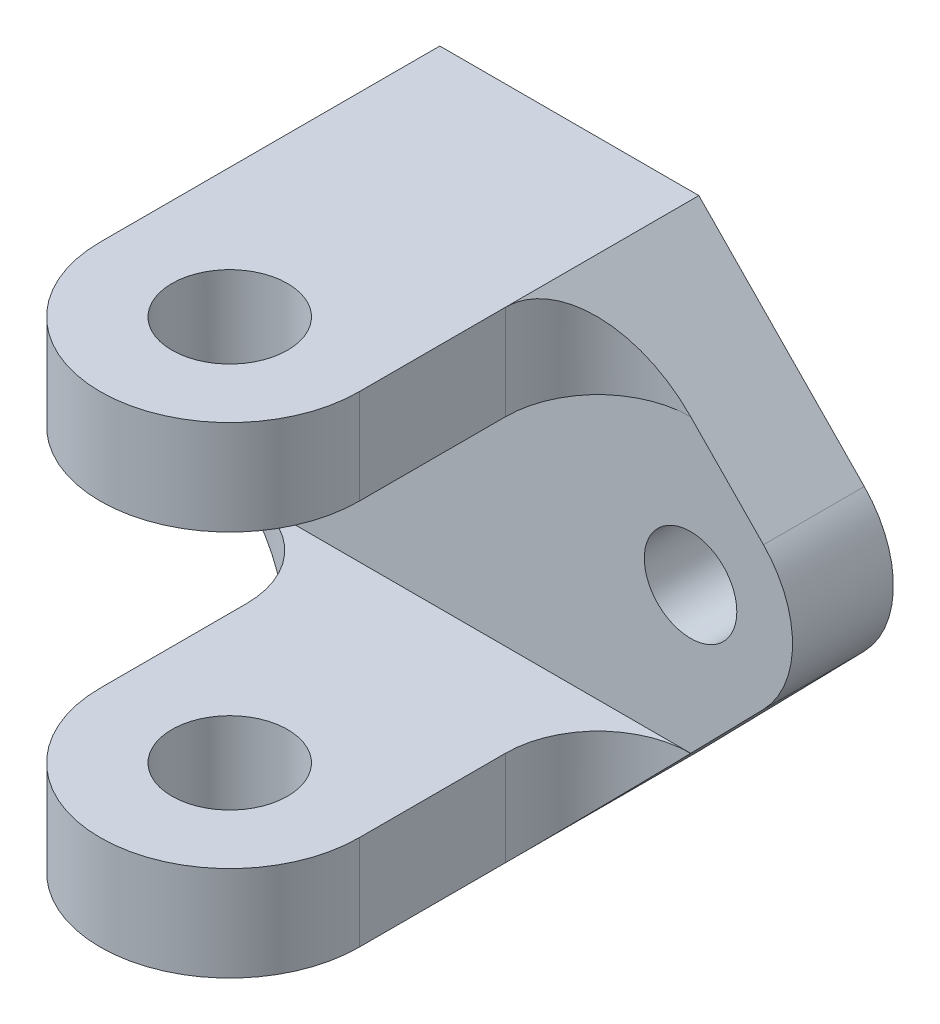
ISO-10303-21;
HEADER;
FILE_DESCRIPTION(('STEP AP214'),'2;1');
FILE_NAME('part.step','',(''),(''),'','','');
FILE_SCHEMA(('AUTOMOTIVE_DESIGN { 1 0 10303 214 1 1 1 1 }'));
ENDSEC;
DATA;
#1=APPLICATION_CONTEXT('core data for automotive mechanical design processes');
#2=APPLICATION_PROTOCOL_DEFINITION('international standard','automotive_design',2000,#1);
#3=PRODUCT_CONTEXT('',#1,'mechanical');
#4=PRODUCT('Part','Part','',(#3));
#5=PRODUCT_RELATED_PRODUCT_CATEGORY('part','',(#4));
#6=PRODUCT_DEFINITION_FORMATION('','',#4);
#7=PRODUCT_DEFINITION_CONTEXT('part definition',#1,'design');
#8=PRODUCT_DEFINITION('design','',#6,#7);
#9=PRODUCT_DEFINITION_SHAPE('','',#8);
#10=(LENGTH_UNIT() NAMED_UNIT(*) SI_UNIT(.MILLI.,.METRE.));
#11=(NAMED_UNIT(*) PLANE_ANGLE_UNIT() SI_UNIT($,.RADIAN.));
#12=(NAMED_UNIT(*) SI_UNIT($,.STERADIAN.) SOLID_ANGLE_UNIT());
#13=UNCERTAINTY_MEASURE_WITH_UNIT(LENGTH_MEASURE(1.E-05),#10,'distance_accuracy_value','');
#14=(GEOMETRIC_REPRESENTATION_CONTEXT(3) GLOBAL_UNCERTAINTY_ASSIGNED_CONTEXT((#13)) GLOBAL_UNIT_ASSIGNED_CONTEXT((#10,
#11,#12)) REPRESENTATION_CONTEXT('',''));
#15=CARTESIAN_POINT('',(0.,0.,0.));
#16=DIRECTION('',(0.,0.,1.));
#17=DIRECTION('',(1.,0.,0.));
#18=AXIS2_PLACEMENT_3D('',#15,#16,#17);
#19=CARTESIAN_POINT('',(-8.89,-87.0039032824825,0.));
#20=DIRECTION('',(1.,0.,0.));
#21=DIRECTION('',(0.,0.,-1.));
#22=AXIS2_PLACEMENT_3D('',#19,#20,#21);
#23=PLANE('',#22);
#24=DIRECTION('',(0.,0.,1.));
#25=VECTOR('',#24,1.);
#26=CARTESIAN_POINT('',(-8.89,16.51,0.));
#27=LINE('',#26,#25);
#28=CARTESIAN_POINT('',(-8.89,16.51,15.81));
#29=VERTEX_POINT('',#28);
#30=CARTESIAN_POINT('',(-8.89,16.51,25.8481308));
#31=VERTEX_POINT('',#30);
#32=EDGE_CURVE('E150',#29,#31,#27,.T.);
#33=ORIENTED_EDGE('',*,*,#32,.F.);
#34=DIRECTION('',(0.,1.,0.));
#35=VECTOR('',#34,1.);
#36=CARTESIAN_POINT('',(-8.89,9.99999999999999,15.81));
#37=LINE('',#36,#35);
#38=CARTESIAN_POINT('',(-8.89,10.,15.81));
#39=VERTEX_POINT('',#38);
#40=EDGE_CURVE('E143',#29,#39,#37,.F.);
#41=ORIENTED_EDGE('',*,*,#40,.T.);
#42=DIRECTION('',(0.,0.,-1.));
#43=VECTOR('',#42,1.);
#44=CARTESIAN_POINT('',(-8.88999999999999,10.,62.46));
#45=LINE('',#44,#43);
#46=CARTESIAN_POINT('',(-8.89,9.99999999999999,25.8481308));
#47=VERTEX_POINT('',#46);
#48=EDGE_CURVE('E147',#47,#39,#45,.T.);
#49=ORIENTED_EDGE('',*,*,#48,.F.);
#50=DIRECTION('',(0.,1.,0.));
#51=VECTOR('',#50,1.);
#52=CARTESIAN_POINT('',(-8.89,-87.0039032824825,25.8481308));
#53=LINE('',#52,#51);
#54=EDGE_CURVE('E296',#47,#31,#53,.T.);
#55=ORIENTED_EDGE('',*,*,#54,.T.);
#56=EDGE_LOOP('',(#33,#41,#49,#55));
#57=FACE_BOUND('',#56,.T.);
#58=ADVANCED_FACE('F43',(#57),#23,.F.);
#59=CARTESIAN_POINT('',(8.89,-87.0039032824825,0.));
#60=DIRECTION('',(1.,0.,0.));
#61=DIRECTION('',(0.,0.,-1.));
#62=AXIS2_PLACEMENT_3D('',#59,#60,#61);
#63=PLANE('',#62);
#64=DIRECTION('',(0.,0.,-1.));
#65=VECTOR('',#64,1.);
#66=CARTESIAN_POINT('',(8.89,10.,62.46));
#67=LINE('',#66,#65);
#68=CARTESIAN_POINT('',(8.89,9.99999999999999,25.8481308));
#69=VERTEX_POINT('',#68);
#70=CARTESIAN_POINT('',(8.89,10.,15.81));
#71=VERTEX_POINT('',#70);
#72=EDGE_CURVE('E166',#69,#71,#67,.T.);
#73=ORIENTED_EDGE('',*,*,#72,.T.);
#74=DIRECTION('',(0.,1.,0.));
#75=VECTOR('',#74,1.);
#76=CARTESIAN_POINT('',(8.89,-87.0039032824825,15.81));
#77=LINE('',#76,#75);
#78=CARTESIAN_POINT('',(8.89,16.51,15.81));
#79=VERTEX_POINT('',#78);
#80=EDGE_CURVE('E232',#71,#79,#77,.T.);
#81=ORIENTED_EDGE('',*,*,#80,.T.);
#82=DIRECTION('',(0.,0.,1.));
#83=VECTOR('',#82,1.);
#84=CARTESIAN_POINT('',(8.89,16.51,0.));
#85=LINE('',#84,#83);
#86=CARTESIAN_POINT('',(8.89,16.51,25.8481308));
#87=VERTEX_POINT('',#86);
#88=EDGE_CURVE('E293',#79,#87,#85,.T.);
#89=ORIENTED_EDGE('',*,*,#88,.T.);
#90=DIRECTION('',(0.,1.,0.));
#91=VECTOR('',#90,1.);
#92=CARTESIAN_POINT('',(8.89,-87.0039032824825,25.8481308));
#93=LINE('',#92,#91);
#94=EDGE_CURVE('E309',#69,#87,#93,.T.);
#95=ORIENTED_EDGE('',*,*,#94,.F.);
#96=EDGE_LOOP('',(#73,#81,#89,#95));
#97=FACE_BOUND('',#96,.T.);
#98=ADVANCED_FACE('F376',(#97),#63,.T.);
#99=CARTESIAN_POINT('',(15.24,0.,45.463373453053));
#100=DIRECTION('',(0.,0.,-1.));
#101=DIRECTION('',(-1.,0.,0.));
#102=AXIS2_PLACEMENT_3D('',#99,#100,#101);
#103=CYLINDRICAL_SURFACE('',#102,7.);
#104=CARTESIAN_POINT('',(15.24,0.,2.54));
#105=DIRECTION('',(0.,0.,1.));
#106=DIRECTION('',(1.,0.,0.));
#107=AXIS2_PLACEMENT_3D('',#104,#105,#106);
#108=CIRCLE('',#107,6.99999999999999);
#109=CARTESIAN_POINT('',(20.2456912582253,-4.89316411203698,2.54));
#110=VERTEX_POINT('',#109);
#111=CARTESIAN_POINT('',(20.2456912582253,4.89316411203699,2.54));
#112=VERTEX_POINT('',#111);
#113=EDGE_CURVE('E492',#110,#112,#108,.T.);
#114=ORIENTED_EDGE('',*,*,#113,.T.);
#115=DIRECTION('',(0.,0.,-1.));
#116=VECTOR('',#115,1.);
#117=CARTESIAN_POINT('',(20.2456912582253,4.89316411203699,25.7050792549621));
#118=LINE('',#117,#116);
#119=CARTESIAN_POINT('',(20.2456912582253,4.89316411203699,9.46));
#120=VERTEX_POINT('',#119);
#121=EDGE_CURVE('E209',#120,#112,#118,.T.);
#122=ORIENTED_EDGE('',*,*,#121,.F.);
#123=CARTESIAN_POINT('',(15.24,0.,9.46));
#124=DIRECTION('',(0.,0.,-1.));
#125=DIRECTION('',(-1.,0.,0.));
#126=AXIS2_PLACEMENT_3D('',#123,#124,#125);
#127=CIRCLE('',#126,7.);
#128=CARTESIAN_POINT('',(20.2456912582253,-4.89316411203699,9.46));
#129=VERTEX_POINT('',#128);
#130=EDGE_CURVE('E207',#129,#120,#127,.F.);
#131=ORIENTED_EDGE('',*,*,#130,.F.);
#132=DIRECTION('',(0.,0.,-1.));
#133=VECTOR('',#132,1.);
#134=CARTESIAN_POINT('',(20.2456912582253,-4.89316411203698,25.7050792549621));
#135=LINE('',#134,#133);
#136=EDGE_CURVE('E271',#129,#110,#135,.T.);
#137=ORIENTED_EDGE('',*,*,#136,.T.);
#138=EDGE_LOOP('',(#114,#122,#131,#137));
#139=FACE_BOUND('',#138,.T.);
#140=ADVANCED_FACE('F438',(#139),#103,.T.);
#141=DIRECTION('',(0.,0.,1.));
#142=VECTOR('',#141,1.);
#143=CARTESIAN_POINT('',(-8.88999999999999,-10.,62.46));
#144=LINE('',#143,#142);
#145=CARTESIAN_POINT('',(-8.89,-10.,15.81));
#146=VERTEX_POINT('',#145);
#147=CARTESIAN_POINT('',(-8.89,-10.,25.8481308));
#148=VERTEX_POINT('',#147);
#149=EDGE_CURVE('E244',#146,#148,#144,.T.);
#150=ORIENTED_EDGE('',*,*,#149,.F.);
#151=DIRECTION('',(0.,-1.,0.));
#152=VECTOR('',#151,1.);
#153=CARTESIAN_POINT('',(-8.89,-16.51,15.81));
#154=LINE('',#153,#152);
#155=CARTESIAN_POINT('',(-8.89,-16.51,15.81));
#156=VERTEX_POINT('',#155);
#157=EDGE_CURVE('E214',#146,#156,#154,.T.);
#158=ORIENTED_EDGE('',*,*,#157,.T.);
#159=DIRECTION('',(0.,0.,1.));
#160=VECTOR('',#159,1.);
#161=CARTESIAN_POINT('',(-8.89,-16.51,0.));
#162=LINE('',#161,#160);
#163=CARTESIAN_POINT('',(-8.89,-16.51,25.8481308));
#164=VERTEX_POINT('',#163);
#165=EDGE_CURVE('E304',#156,#164,#162,.T.);
#166=ORIENTED_EDGE('',*,*,#165,.T.);
#167=EDGE_CURVE('E255',#164,#148,#53,.T.);
#168=ORIENTED_EDGE('',*,*,#167,.T.);
#169=EDGE_LOOP('',(#150,#158,#166,#168));
#170=FACE_BOUND('',#169,.T.);
#171=ADVANCED_FACE('F251',(#170),#23,.F.);
#172=CARTESIAN_POINT('',(-15.24,0.,45.463373453053));
#173=DIRECTION('',(0.,0.,-1.));
#174=DIRECTION('',(-1.,0.,0.));
#175=AXIS2_PLACEMENT_3D('',#172,#173,#174);
#176=CYLINDRICAL_SURFACE('',#175,7.);
#177=DIRECTION('',(0.,0.,-1.));
#178=VECTOR('',#177,1.);
#179=CARTESIAN_POINT('',(-20.2456912582253,4.89316411203698,25.7050792549621));
#180=LINE('',#179,#178);
#181=CARTESIAN_POINT('',(-20.2456912582253,4.89316411203698,9.46));
#182=VERTEX_POINT('',#181);
#183=CARTESIAN_POINT('',(-20.2456912582253,4.89316411203698,2.54));
#184=VERTEX_POINT('',#183);
#185=EDGE_CURVE('E210',#182,#184,#180,.T.);
#186=ORIENTED_EDGE('',*,*,#185,.T.);
#187=CARTESIAN_POINT('',(-15.24,0.,2.54));
#188=DIRECTION('',(0.,0.,1.));
#189=DIRECTION('',(1.,0.,0.));
#190=AXIS2_PLACEMENT_3D('',#187,#188,#189);
#191=CIRCLE('',#190,7.);
#192=CARTESIAN_POINT('',(-20.2456912582253,-4.89316411203699,2.54));
#193=VERTEX_POINT('',#192);
#194=EDGE_CURVE('E59',#184,#193,#191,.T.);
#195=ORIENTED_EDGE('',*,*,#194,.T.);
#196=DIRECTION('',(0.,0.,-1.));
#197=VECTOR('',#196,1.);
#198=CARTESIAN_POINT('',(-20.2456912582253,-4.89316411203699,25.7050792549621));
#199=LINE('',#198,#197);
#200=CARTESIAN_POINT('',(-20.2456912582253,-4.89316411203699,9.46));
#201=VERTEX_POINT('',#200);
#202=EDGE_CURVE('E112',#201,#193,#199,.T.);
#203=ORIENTED_EDGE('',*,*,#202,.F.);
#204=CARTESIAN_POINT('',(-15.24,0.,9.46));
#205=DIRECTION('',(0.,0.,-1.));
#206=DIRECTION('',(-1.,0.,0.));
#207=AXIS2_PLACEMENT_3D('',#204,#205,#206);
#208=CIRCLE('',#207,7.);
#209=EDGE_CURVE('E266',#201,#182,#208,.T.);
#210=ORIENTED_EDGE('',*,*,#209,.T.);
#211=EDGE_LOOP('',(#186,#195,#203,#210));
#212=FACE_BOUND('',#211,.T.);
#213=ADVANCED_FACE('F430',(#212),#176,.T.);
#214=DIRECTION('',(0.,0.,1.));
#215=VECTOR('',#214,1.);
#216=CARTESIAN_POINT('',(8.89,-16.51,0.));
#217=LINE('',#216,#215);
#218=CARTESIAN_POINT('',(8.89,-16.51,15.81));
#219=VERTEX_POINT('',#218);
#220=CARTESIAN_POINT('',(8.89,-16.51,25.8481308));
#221=VERTEX_POINT('',#220);
#222=EDGE_CURVE('E300',#219,#221,#217,.T.);
#223=ORIENTED_EDGE('',*,*,#222,.F.);
#224=DIRECTION('',(0.,-1.,0.));
#225=VECTOR('',#224,1.);
#226=CARTESIAN_POINT('',(8.89,-87.0039032824825,15.81));
#227=LINE('',#226,#225);
#228=CARTESIAN_POINT('',(8.89,-9.99999999999999,15.81));
#229=VERTEX_POINT('',#228);
#230=EDGE_CURVE('E155',#219,#229,#227,.F.);
#231=ORIENTED_EDGE('',*,*,#230,.T.);
#232=DIRECTION('',(0.,0.,1.));
#233=VECTOR('',#232,1.);
#234=CARTESIAN_POINT('',(8.89,-9.99999999999999,62.46));
#235=LINE('',#234,#233);
#236=CARTESIAN_POINT('',(8.89,-9.99999999999999,25.8481308));
#237=VERTEX_POINT('',#236);
#238=EDGE_CURVE('E221',#229,#237,#235,.T.);
#239=ORIENTED_EDGE('',*,*,#238,.T.);
#240=EDGE_CURVE('E305',#221,#237,#93,.T.);
#241=ORIENTED_EDGE('',*,*,#240,.F.);
#242=EDGE_LOOP('',(#223,#231,#239,#241));
#243=FACE_BOUND('',#242,.T.);
#244=ADVANCED_FACE('F352',(#243),#63,.T.);
#245=CARTESIAN_POINT('',(-23.24,10.,62.46));
#246=DIRECTION('',(0.,1.,0.));
#247=DIRECTION('',(0.,0.,1.));
#248=AXIS2_PLACEMENT_3D('',#245,#246,#247);
#249=PLANE('',#248);
#250=CARTESIAN_POINT('',(0.,10.,25.8481308));
#251=DIRECTION('',(0.,1.,0.));
#252=DIRECTION('',(0.,0.,1.));
#253=AXIS2_PLACEMENT_3D('',#250,#251,#252);
#254=CIRCLE('',#253,3.96875);
#255=CARTESIAN_POINT('',(0.,10.,29.8168808));
#256=VERTEX_POINT('',#255);
#257=EDGE_CURVE('E327',#256,#256,#254,.T.);
#258=ORIENTED_EDGE('',*,*,#257,.T.);
#259=EDGE_LOOP('',(#258));
#260=FACE_BOUND('',#259,.T.);
#261=ORIENTED_EDGE('',*,*,#72,.F.);
#262=CARTESIAN_POINT('',(0.,9.99999999999999,25.8481308));
#263=DIRECTION('',(0.,1.,0.));
#264=DIRECTION('',(0.,0.,1.));
#265=AXIS2_PLACEMENT_3D('',#262,#263,#264);
#266=CIRCLE('',#265,8.89);
#267=EDGE_CURVE('E164',#47,#69,#266,.T.);
#268=ORIENTED_EDGE('',*,*,#267,.F.);
#269=ORIENTED_EDGE('',*,*,#48,.T.);
#270=CARTESIAN_POINT('',(-15.24,10.,15.81));
#271=DIRECTION('',(0.,1.,0.));
#272=DIRECTION('',(0.,0.,1.));
#273=AXIS2_PLACEMENT_3D('',#270,#271,#272);
#274=CIRCLE('',#273,6.35);
#275=CARTESIAN_POINT('',(-15.24,10.,9.46));
#276=VERTEX_POINT('',#275);
#277=EDGE_CURVE('E161',#39,#276,#274,.T.);
#278=ORIENTED_EDGE('',*,*,#277,.T.);
#279=DIRECTION('',(1.,0.,0.));
#280=VECTOR('',#279,1.);
#281=CARTESIAN_POINT('',(-23.24,10.,9.46));
#282=LINE('',#281,#280);
#283=CARTESIAN_POINT('',(15.24,10.,9.46));
#284=VERTEX_POINT('',#283);
#285=EDGE_CURVE('E333',#276,#284,#282,.T.);
#286=ORIENTED_EDGE('',*,*,#285,.T.);
#287=CARTESIAN_POINT('',(15.24,9.99999999999999,15.81));
#288=DIRECTION('',(0.,1.,0.));
#289=DIRECTION('',(0.,0.,1.));
#290=AXIS2_PLACEMENT_3D('',#287,#288,#289);
#291=CIRCLE('',#290,6.35);
#292=EDGE_CURVE('E11',#284,#71,#291,.T.);
#293=ORIENTED_EDGE('',*,*,#292,.T.);
#294=EDGE_LOOP('',(#261,#268,#269,#278,#286,#293));
#295=FACE_BOUND('',#294,.T.);
#296=ADVANCED_FACE('F160',(#260,#295),#249,.F.);
#297=CARTESIAN_POINT('',(-23.24,-10.,62.46));
#298=DIRECTION('',(0.,-1.,0.));
#299=DIRECTION('',(1.,0.,0.));
#300=AXIS2_PLACEMENT_3D('',#297,#298,#299);
#301=PLANE('',#300);
#302=CARTESIAN_POINT('',(0.,-9.99999999999999,25.8481308));
#303=DIRECTION('',(0.,-1.,0.));
#304=DIRECTION('',(1.,0.,0.));
#305=AXIS2_PLACEMENT_3D('',#302,#303,#304);
#306=CIRCLE('',#305,3.96875);
#307=CARTESIAN_POINT('',(3.96875,-9.99999999999999,25.8481308));
#308=VERTEX_POINT('',#307);
#309=EDGE_CURVE('E326',#308,#308,#306,.T.);
#310=ORIENTED_EDGE('',*,*,#309,.T.);
#311=EDGE_LOOP('',(#310));
#312=FACE_BOUND('',#311,.T.);
#313=ORIENTED_EDGE('',*,*,#238,.F.);
#314=CARTESIAN_POINT('',(15.24,-9.99999999999999,15.81));
#315=DIRECTION('',(0.,-1.,0.));
#316=DIRECTION('',(1.,0.,0.));
#317=AXIS2_PLACEMENT_3D('',#314,#315,#316);
#318=CIRCLE('',#317,6.35);
#319=CARTESIAN_POINT('',(15.24,-9.99999999999999,9.46));
#320=VERTEX_POINT('',#319);
#321=EDGE_CURVE('E178',#229,#320,#318,.T.);
#322=ORIENTED_EDGE('',*,*,#321,.T.);
#323=DIRECTION('',(-1.,0.,0.));
#324=VECTOR('',#323,1.);
#325=CARTESIAN_POINT('',(-23.24,-10.,9.46));
#326=LINE('',#325,#324);
#327=CARTESIAN_POINT('',(-15.24,-10.,9.46));
#328=VERTEX_POINT('',#327);
#329=EDGE_CURVE('E246',#320,#328,#326,.T.);
#330=ORIENTED_EDGE('',*,*,#329,.T.);
#331=CARTESIAN_POINT('',(-15.24,-10.,15.81));
#332=DIRECTION('',(0.,-1.,0.));
#333=DIRECTION('',(1.,0.,0.));
#334=AXIS2_PLACEMENT_3D('',#331,#332,#333);
#335=CIRCLE('',#334,6.35);
#336=EDGE_CURVE('E180',#328,#146,#335,.T.);
#337=ORIENTED_EDGE('',*,*,#336,.T.);
#338=ORIENTED_EDGE('',*,*,#149,.T.);
#339=CARTESIAN_POINT('',(0.,-9.99999999999999,25.8481308));
#340=DIRECTION('',(0.,-1.,0.));
#341=DIRECTION('',(1.,0.,0.));
#342=AXIS2_PLACEMENT_3D('',#339,#340,#341);
#343=CIRCLE('',#342,8.89);
#344=EDGE_CURVE('E258',#237,#148,#343,.T.);
#345=ORIENTED_EDGE('',*,*,#344,.F.);
#346=EDGE_LOOP('',(#313,#322,#330,#337,#338,#345));
#347=FACE_BOUND('',#346,.T.);
#348=ADVANCED_FACE('F242',(#312,#347),#301,.F.);
#349=CARTESIAN_POINT('',(0.,0.,9.46));
#350=DIRECTION('',(0.,0.,-1.));
#351=DIRECTION('',(-1.,0.,0.));
#352=AXIS2_PLACEMENT_3D('',#349,#350,#351);
#353=PLANE('',#352);
#354=DIRECTION('',(0.699023444576713,-0.715098751175044,0.));
#355=VECTOR('',#354,1.);
#356=CARTESIAN_POINT('',(-12.7989125109506,-12.5111949860624,9.46));
#357=LINE('',#356,#355);
#358=CARTESIAN_POINT('',(-15.24,-10.0139702814099,9.46));
#359=VERTEX_POINT('',#358);
#360=EDGE_CURVE('E264',#201,#359,#357,.T.);
#361=ORIENTED_EDGE('',*,*,#360,.T.);
#362=DIRECTION('',(0.,-1.,0.));
#363=VECTOR('',#362,1.);
#364=CARTESIAN_POINT('',(-15.24,-9.99999999999999,9.46));
#365=LINE('',#364,#363);
#366=EDGE_CURVE('E156',#359,#328,#365,.F.);
#367=ORIENTED_EDGE('',*,*,#366,.T.);
#368=ORIENTED_EDGE('',*,*,#329,.F.);
#369=DIRECTION('',(0.,-1.,0.));
#370=VECTOR('',#369,1.);
#371=CARTESIAN_POINT('',(15.24,0.,9.46));
#372=LINE('',#371,#370);
#373=CARTESIAN_POINT('',(15.24,-10.0139702814099,9.46));
#374=VERTEX_POINT('',#373);
#375=EDGE_CURVE('E213',#320,#374,#372,.T.);
#376=ORIENTED_EDGE('',*,*,#375,.T.);
#377=DIRECTION('',(-0.699023444576713,-0.715098751175044,0.));
#378=VECTOR('',#377,1.);
#379=CARTESIAN_POINT('',(12.7989125109506,-12.5111949860624,9.46));
#380=LINE('',#379,#378);
#381=EDGE_CURVE('E275',#129,#374,#380,.T.);
#382=ORIENTED_EDGE('',*,*,#381,.F.);
#383=ORIENTED_EDGE('',*,*,#130,.T.);
#384=DIRECTION('',(-0.699023444576713,0.715098751175044,0.));
#385=VECTOR('',#384,1.);
#386=CARTESIAN_POINT('',(8.89,16.51,9.46));
#387=LINE('',#386,#385);
#388=CARTESIAN_POINT('',(15.24,10.0139702814099,9.46));
#389=VERTEX_POINT('',#388);
#390=EDGE_CURVE('E192',#120,#389,#387,.T.);
#391=ORIENTED_EDGE('',*,*,#390,.T.);
#392=DIRECTION('',(0.,1.,0.));
#393=VECTOR('',#392,1.);
#394=CARTESIAN_POINT('',(15.24,0.,9.46));
#395=LINE('',#394,#393);
#396=EDGE_CURVE('E204',#389,#284,#395,.F.);
#397=ORIENTED_EDGE('',*,*,#396,.T.);
#398=ORIENTED_EDGE('',*,*,#285,.F.);
#399=DIRECTION('',(0.,1.,0.));
#400=VECTOR('',#399,1.);
#401=CARTESIAN_POINT('',(-15.24,16.51,9.46));
#402=LINE('',#401,#400);
#403=CARTESIAN_POINT('',(-15.24,10.0139702814099,9.46));
#404=VERTEX_POINT('',#403);
#405=EDGE_CURVE('E170',#276,#404,#402,.T.);
#406=ORIENTED_EDGE('',*,*,#405,.T.);
#407=DIRECTION('',(0.699023444576713,0.715098751175044,0.));
#408=VECTOR('',#407,1.);
#409=CARTESIAN_POINT('',(-8.89,16.51,9.46));
#410=LINE('',#409,#408);
#411=EDGE_CURVE('E424',#182,#404,#410,.T.);
#412=ORIENTED_EDGE('',*,*,#411,.F.);
#413=ORIENTED_EDGE('',*,*,#209,.F.);
#414=EDGE_LOOP('',(#361,#367,#368,#376,#382,#383,#391,#397,#398,#406,#412,#413));
#415=FACE_BOUND('',#414,.T.);
#416=CARTESIAN_POINT('',(15.24,0.,9.46));
#417=DIRECTION('',(0.,0.,1.));
#418=DIRECTION('',(1.,0.,0.));
#419=AXIS2_PLACEMENT_3D('',#416,#417,#418);
#420=CIRCLE('',#419,3.175);
#421=CARTESIAN_POINT('',(18.415,0.,9.46));
#422=VERTEX_POINT('',#421);
#423=EDGE_CURVE('E259',#422,#422,#420,.T.);
#424=ORIENTED_EDGE('',*,*,#423,.F.);
#425=EDGE_LOOP('',(#424));
#426=FACE_BOUND('',#425,.T.);
#427=CARTESIAN_POINT('',(-15.24,0.,9.46));
#428=DIRECTION('',(0.,0.,1.));
#429=DIRECTION('',(1.,0.,0.));
#430=AXIS2_PLACEMENT_3D('',#427,#428,#429);
#431=CIRCLE('',#430,3.175);
#432=CARTESIAN_POINT('',(-12.065,0.,9.46));
#433=VERTEX_POINT('',#432);
#434=EDGE_CURVE('E336',#433,#433,#431,.T.);
#435=ORIENTED_EDGE('',*,*,#434,.F.);
#436=EDGE_LOOP('',(#435));
#437=FACE_BOUND('',#436,.T.);
#438=ADVANCED_FACE('F202',(#415,#426,#437),#353,.F.);
#439=CARTESIAN_POINT('',(-23.24,16.51,9.46));
#440=DIRECTION('',(0.,-1.,0.));
#441=DIRECTION('',(0.,0.,-1.));
#442=AXIS2_PLACEMENT_3D('',#439,#440,#441);
#443=PLANE('',#442);
#444=CARTESIAN_POINT('',(0.,16.51,25.8481308));
#445=DIRECTION('',(0.,-1.,0.));
#446=DIRECTION('',(0.,0.,-1.));
#447=AXIS2_PLACEMENT_3D('',#444,#445,#446);
#448=CIRCLE('',#447,3.96875);
#449=CARTESIAN_POINT('',(0.,16.51,21.8793808));
#450=VERTEX_POINT('',#449);
#451=EDGE_CURVE('E318',#450,#450,#448,.T.);
#452=ORIENTED_EDGE('',*,*,#451,.T.);
#453=EDGE_LOOP('',(#452));
#454=FACE_BOUND('',#453,.T.);
#455=CARTESIAN_POINT('',(8.89,16.51,2.54));
#456=VERTEX_POINT('',#455);
#457=EDGE_CURVE('E80',#456,#79,#85,.T.);
#458=ORIENTED_EDGE('',*,*,#457,.F.);
#459=DIRECTION('',(-1.,0.,0.));
#460=VECTOR('',#459,1.);
#461=CARTESIAN_POINT('',(8.89,16.51,2.54));
#462=LINE('',#461,#460);
#463=CARTESIAN_POINT('',(-8.89,16.51,2.54));
#464=VERTEX_POINT('',#463);
#465=EDGE_CURVE('E414',#456,#464,#462,.T.);
#466=ORIENTED_EDGE('',*,*,#465,.T.);
#467=EDGE_CURVE('E286',#464,#29,#27,.T.);
#468=ORIENTED_EDGE('',*,*,#467,.T.);
#469=ORIENTED_EDGE('',*,*,#32,.T.);
#470=CARTESIAN_POINT('',(0.,16.51,25.8481308));
#471=DIRECTION('',(0.,-1.,0.));
#472=DIRECTION('',(0.,0.,-1.));
#473=AXIS2_PLACEMENT_3D('',#470,#471,#472);
#474=CIRCLE('',#473,8.89);
#475=EDGE_CURVE('E289',#87,#31,#474,.T.);
#476=ORIENTED_EDGE('',*,*,#475,.F.);
#477=ORIENTED_EDGE('',*,*,#88,.F.);
#478=EDGE_LOOP('',(#458,#466,#468,#469,#476,#477));
#479=FACE_BOUND('',#478,.T.);
#480=ADVANCED_FACE('F384',(#454,#479),#443,.F.);
#481=CARTESIAN_POINT('',(-23.24,-16.51,9.46));
#482=DIRECTION('',(0.,1.,0.));
#483=DIRECTION('',(0.,0.,1.));
#484=AXIS2_PLACEMENT_3D('',#481,#482,#483);
#485=PLANE('',#484);
#486=CARTESIAN_POINT('',(-8.89,-16.51,2.54));
#487=VERTEX_POINT('',#486);
#488=EDGE_CURVE('E101',#487,#156,#162,.T.);
#489=ORIENTED_EDGE('',*,*,#488,.F.);
#490=DIRECTION('',(1.,0.,0.));
#491=VECTOR('',#490,1.);
#492=CARTESIAN_POINT('',(-8.89,-16.51,2.54));
#493=LINE('',#492,#491);
#494=CARTESIAN_POINT('',(8.89,-16.51,2.54));
#495=VERTEX_POINT('',#494);
#496=EDGE_CURVE('E755',#487,#495,#493,.T.);
#497=ORIENTED_EDGE('',*,*,#496,.T.);
#498=EDGE_CURVE('E68',#495,#219,#217,.T.);
#499=ORIENTED_EDGE('',*,*,#498,.T.);
#500=ORIENTED_EDGE('',*,*,#222,.T.);
#501=CARTESIAN_POINT('',(0.,-16.51,25.8481308));
#502=DIRECTION('',(0.,1.,0.));
#503=DIRECTION('',(0.,0.,1.));
#504=AXIS2_PLACEMENT_3D('',#501,#502,#503);
#505=CIRCLE('',#504,8.89);
#506=EDGE_CURVE('E299',#221,#164,#505,.F.);
#507=ORIENTED_EDGE('',*,*,#506,.T.);
#508=ORIENTED_EDGE('',*,*,#165,.F.);
#509=EDGE_LOOP('',(#489,#497,#499,#500,#507,#508));
#510=FACE_BOUND('',#509,.T.);
#511=CARTESIAN_POINT('',(0.,-16.51,25.8481308));
#512=DIRECTION('',(0.,1.,0.));
#513=DIRECTION('',(0.,0.,1.));
#514=AXIS2_PLACEMENT_3D('',#511,#512,#513);
#515=CIRCLE('',#514,3.96875);
#516=CARTESIAN_POINT('',(0.,-16.51,29.8168808));
#517=VERTEX_POINT('',#516);
#518=EDGE_CURVE('E322',#517,#517,#515,.F.);
#519=ORIENTED_EDGE('',*,*,#518,.F.);
#520=EDGE_LOOP('',(#519));
#521=FACE_BOUND('',#520,.T.);
#522=ADVANCED_FACE('F363',(#510,#521),#485,.F.);
#523=CARTESIAN_POINT('',(15.24,0.,9.46));
#524=DIRECTION('',(0.,0.,-1.));
#525=DIRECTION('',(-1.,0.,0.));
#526=AXIS2_PLACEMENT_3D('',#523,#524,#525);
#527=CYLINDRICAL_SURFACE('',#526,3.175);
#528=CARTESIAN_POINT('',(15.24,0.,2.54));
#529=DIRECTION('',(0.,0.,1.));
#530=DIRECTION('',(1.,0.,0.));
#531=AXIS2_PLACEMENT_3D('',#528,#529,#530);
#532=CIRCLE('',#531,3.175);
#533=CARTESIAN_POINT('',(18.415,0.,2.54));
#534=VERTEX_POINT('',#533);
#535=EDGE_CURVE('E426',#534,#534,#532,.T.);
#536=ORIENTED_EDGE('',*,*,#535,.F.);
#537=EDGE_LOOP('',(#536));
#538=FACE_BOUND('',#537,.T.);
#539=ORIENTED_EDGE('',*,*,#423,.T.);
#540=EDGE_LOOP('',(#539));
#541=FACE_BOUND('',#540,.T.);
#542=ADVANCED_FACE('F464',(#538,#541),#527,.F.);
#543=CARTESIAN_POINT('',(-15.24,0.,9.46));
#544=DIRECTION('',(0.,0.,-1.));
#545=DIRECTION('',(-1.,0.,0.));
#546=AXIS2_PLACEMENT_3D('',#543,#544,#545);
#547=CYLINDRICAL_SURFACE('',#546,3.175);
#548=CARTESIAN_POINT('',(-15.24,0.,2.54));
#549=DIRECTION('',(0.,0.,1.));
#550=DIRECTION('',(1.,0.,0.));
#551=AXIS2_PLACEMENT_3D('',#548,#549,#550);
#552=CIRCLE('',#551,3.175);
#553=CARTESIAN_POINT('',(-12.065,0.,2.54));
#554=VERTEX_POINT('',#553);
#555=EDGE_CURVE('E495',#554,#554,#552,.T.);
#556=ORIENTED_EDGE('',*,*,#555,.F.);
#557=EDGE_LOOP('',(#556));
#558=FACE_BOUND('',#557,.T.);
#559=ORIENTED_EDGE('',*,*,#434,.T.);
#560=EDGE_LOOP('',(#559));
#561=FACE_BOUND('',#560,.T.);
#562=ADVANCED_FACE('F461',(#558,#561),#547,.F.);
#563=CARTESIAN_POINT('',(0.,-27.7353201513364,25.8481308));
#564=DIRECTION('',(0.,1.,0.));
#565=DIRECTION('',(0.,0.,1.));
#566=AXIS2_PLACEMENT_3D('',#563,#564,#565);
#567=CYLINDRICAL_SURFACE('',#566,3.96875);
#568=ORIENTED_EDGE('',*,*,#518,.T.);
#569=EDGE_LOOP('',(#568));
#570=FACE_BOUND('',#569,.T.);
#571=ORIENTED_EDGE('',*,*,#309,.F.);
#572=EDGE_LOOP('',(#571));
#573=FACE_BOUND('',#572,.T.);
#574=ADVANCED_FACE('F453',(#570,#573),#567,.F.);
#575=ORIENTED_EDGE('',*,*,#451,.F.);
#576=EDGE_LOOP('',(#575));
#577=FACE_BOUND('',#576,.T.);
#578=ORIENTED_EDGE('',*,*,#257,.F.);
#579=EDGE_LOOP('',(#578));
#580=FACE_BOUND('',#579,.T.);
#581=ADVANCED_FACE('F450',(#577,#580),#567,.F.);
#582=CARTESIAN_POINT('',(0.,-87.0039032824825,25.8481308));
#583=DIRECTION('',(0.,1.,0.));
#584=DIRECTION('',(0.,0.,1.));
#585=AXIS2_PLACEMENT_3D('',#582,#583,#584);
#586=CYLINDRICAL_SURFACE('',#585,8.89);
#587=ORIENTED_EDGE('',*,*,#344,.T.);
#588=ORIENTED_EDGE('',*,*,#167,.F.);
#589=ORIENTED_EDGE('',*,*,#506,.F.);
#590=ORIENTED_EDGE('',*,*,#240,.T.);
#591=EDGE_LOOP('',(#587,#588,#589,#590));
#592=FACE_BOUND('',#591,.T.);
#593=ADVANCED_FACE('F359',(#592),#586,.T.);
#594=ORIENTED_EDGE('',*,*,#267,.T.);
#595=ORIENTED_EDGE('',*,*,#94,.T.);
#596=ORIENTED_EDGE('',*,*,#475,.T.);
#597=ORIENTED_EDGE('',*,*,#54,.F.);
#598=EDGE_LOOP('',(#594,#595,#596,#597));
#599=FACE_BOUND('',#598,.T.);
#600=ADVANCED_FACE('F371',(#599),#586,.T.);
#601=CARTESIAN_POINT('',(12.7989125109506,-12.5111949860624,25.7050792549621));
#602=DIRECTION('',(-0.715098751175044,0.699023444576713,0.));
#603=DIRECTION('',(-0.699023444576713,-0.715098751175044,0.));
#604=AXIS2_PLACEMENT_3D('',#601,#602,#603);
#605=PLANE('',#604);
#606=ORIENTED_EDGE('',*,*,#498,.F.);
#607=DIRECTION('',(0.699023444576713,0.715098751175044,0.));
#608=VECTOR('',#607,1.);
#609=CARTESIAN_POINT('',(8.89,-16.51,2.54));
#610=LINE('',#609,#608);
#611=EDGE_CURVE('E489',#495,#110,#610,.T.);
#612=ORIENTED_EDGE('',*,*,#611,.T.);
#613=ORIENTED_EDGE('',*,*,#136,.F.);
#614=ORIENTED_EDGE('',*,*,#381,.T.);
#615=CARTESIAN_POINT('',(15.24,-10.0139702814099,15.81));
#616=DIRECTION('',(-0.715098751175044,0.699023444576713,0.));
#617=DIRECTION('',(-0.699023444576713,-0.715098751175044,0.));
#618=AXIS2_PLACEMENT_3D('',#615,#616,#617);
#619=ELLIPSE('',#618,9.08410161242186,6.35);
#620=EDGE_CURVE('E172',#374,#219,#619,.T.);
#621=ORIENTED_EDGE('',*,*,#620,.T.);
#622=EDGE_LOOP('',(#606,#612,#613,#614,#621));
#623=FACE_BOUND('',#622,.T.);
#624=ADVANCED_FACE('F449',(#623),#605,.F.);
#625=CARTESIAN_POINT('',(-12.7989125109506,-12.5111949860624,25.7050792549621));
#626=DIRECTION('',(-0.715098751175044,-0.699023444576713,0.));
#627=DIRECTION('',(0.699023444576713,-0.715098751175044,0.));
#628=AXIS2_PLACEMENT_3D('',#625,#626,#627);
#629=PLANE('',#628);
#630=DIRECTION('',(0.699023444576713,-0.715098751175044,0.));
#631=VECTOR('',#630,1.);
#632=CARTESIAN_POINT('',(-20.2456912582253,-4.89316411203699,2.54));
#633=LINE('',#632,#631);
#634=EDGE_CURVE('E758',#193,#487,#633,.T.);
#635=ORIENTED_EDGE('',*,*,#634,.T.);
#636=ORIENTED_EDGE('',*,*,#488,.T.);
#637=CARTESIAN_POINT('',(-15.24,-10.0139702814099,15.81));
#638=DIRECTION('',(-0.715098751175044,-0.699023444576713,0.));
#639=DIRECTION('',(-0.699023444576713,0.715098751175044,0.));
#640=AXIS2_PLACEMENT_3D('',#637,#638,#639);
#641=ELLIPSE('',#640,9.08410161242186,6.35);
#642=EDGE_CURVE('E235',#156,#359,#641,.F.);
#643=ORIENTED_EDGE('',*,*,#642,.T.);
#644=ORIENTED_EDGE('',*,*,#360,.F.);
#645=ORIENTED_EDGE('',*,*,#202,.T.);
#646=EDGE_LOOP('',(#635,#636,#643,#644,#645));
#647=FACE_BOUND('',#646,.T.);
#648=ADVANCED_FACE('F263',(#647),#629,.T.);
#649=CARTESIAN_POINT('',(8.89,16.51,25.7050792549621));
#650=DIRECTION('',(0.715098751175044,0.699023444576713,0.));
#651=DIRECTION('',(-0.699023444576713,0.715098751175044,0.));
#652=AXIS2_PLACEMENT_3D('',#649,#650,#651);
#653=PLANE('',#652);
#654=DIRECTION('',(-0.699023444576713,0.715098751175044,0.));
#655=VECTOR('',#654,1.);
#656=CARTESIAN_POINT('',(20.2456912582253,4.89316411203699,2.54));
#657=LINE('',#656,#655);
#658=EDGE_CURVE('E493',#112,#456,#657,.T.);
#659=ORIENTED_EDGE('',*,*,#658,.T.);
#660=ORIENTED_EDGE('',*,*,#457,.T.);
#661=CARTESIAN_POINT('',(15.24,10.0139702814099,15.81));
#662=DIRECTION('',(0.715098751175044,0.699023444576713,0.));
#663=DIRECTION('',(-0.699023444576713,0.715098751175044,0.));
#664=AXIS2_PLACEMENT_3D('',#661,#662,#663);
#665=ELLIPSE('',#664,9.08410161242186,6.35);
#666=EDGE_CURVE('E52',#79,#389,#665,.F.);
#667=ORIENTED_EDGE('',*,*,#666,.T.);
#668=ORIENTED_EDGE('',*,*,#390,.F.);
#669=ORIENTED_EDGE('',*,*,#121,.T.);
#670=EDGE_LOOP('',(#659,#660,#667,#668,#669));
#671=FACE_BOUND('',#670,.T.);
#672=ADVANCED_FACE('F189',(#671),#653,.T.);
#673=CARTESIAN_POINT('',(-8.89,16.51,25.7050792549621));
#674=DIRECTION('',(0.715098751175044,-0.699023444576713,0.));
#675=DIRECTION('',(0.699023444576713,0.715098751175044,0.));
#676=AXIS2_PLACEMENT_3D('',#673,#674,#675);
#677=PLANE('',#676);
#678=ORIENTED_EDGE('',*,*,#467,.F.);
#679=DIRECTION('',(-0.699023444576713,-0.715098751175044,0.));
#680=VECTOR('',#679,1.);
#681=CARTESIAN_POINT('',(-8.89,16.51,2.54));
#682=LINE('',#681,#680);
#683=EDGE_CURVE('E412',#464,#184,#682,.T.);
#684=ORIENTED_EDGE('',*,*,#683,.T.);
#685=ORIENTED_EDGE('',*,*,#185,.F.);
#686=ORIENTED_EDGE('',*,*,#411,.T.);
#687=CARTESIAN_POINT('',(-15.24,10.0139702814099,15.81));
#688=DIRECTION('',(0.715098751175044,-0.699023444576713,0.));
#689=DIRECTION('',(-0.699023444576713,-0.715098751175044,0.));
#690=AXIS2_PLACEMENT_3D('',#687,#688,#689);
#691=ELLIPSE('',#690,9.08410161242186,6.35);
#692=EDGE_CURVE('E173',#404,#29,#691,.T.);
#693=ORIENTED_EDGE('',*,*,#692,.T.);
#694=EDGE_LOOP('',(#678,#684,#685,#686,#693));
#695=FACE_BOUND('',#694,.T.);
#696=ADVANCED_FACE('F422',(#695),#677,.F.);
#697=CARTESIAN_POINT('',(-15.24,-87.0039032824825,15.81));
#698=DIRECTION('',(0.,1.,0.));
#699=DIRECTION('',(0.,0.,1.));
#700=AXIS2_PLACEMENT_3D('',#697,#698,#699);
#701=CYLINDRICAL_SURFACE('',#700,6.35);
#702=ORIENTED_EDGE('',*,*,#336,.F.);
#703=ORIENTED_EDGE('',*,*,#366,.F.);
#704=ORIENTED_EDGE('',*,*,#642,.F.);
#705=ORIENTED_EDGE('',*,*,#157,.F.);
#706=EDGE_LOOP('',(#702,#703,#704,#705));
#707=FACE_BOUND('',#706,.T.);
#708=ADVANCED_FACE('F261',(#707),#701,.F.);
#709=CARTESIAN_POINT('',(-15.24,0.,15.81));
#710=DIRECTION('',(0.,-1.,0.));
#711=DIRECTION('',(0.,0.,-1.));
#712=AXIS2_PLACEMENT_3D('',#709,#710,#711);
#713=CYLINDRICAL_SURFACE('',#712,6.35);
#714=ORIENTED_EDGE('',*,*,#277,.F.);
#715=ORIENTED_EDGE('',*,*,#40,.F.);
#716=ORIENTED_EDGE('',*,*,#692,.F.);
#717=ORIENTED_EDGE('',*,*,#405,.F.);
#718=EDGE_LOOP('',(#714,#715,#716,#717));
#719=FACE_BOUND('',#718,.T.);
#720=ADVANCED_FACE('F168',(#719),#713,.F.);
#721=CARTESIAN_POINT('',(15.24,0.,15.81));
#722=DIRECTION('',(0.,-1.,0.));
#723=DIRECTION('',(0.,0.,-1.));
#724=AXIS2_PLACEMENT_3D('',#721,#722,#723);
#725=CYLINDRICAL_SURFACE('',#724,6.35);
#726=ORIENTED_EDGE('',*,*,#321,.F.);
#727=ORIENTED_EDGE('',*,*,#230,.F.);
#728=ORIENTED_EDGE('',*,*,#620,.F.);
#729=ORIENTED_EDGE('',*,*,#375,.F.);
#730=EDGE_LOOP('',(#726,#727,#728,#729));
#731=FACE_BOUND('',#730,.T.);
#732=ADVANCED_FACE('F479',(#731),#725,.F.);
#733=CARTESIAN_POINT('',(15.24,-87.0039032824825,15.81));
#734=DIRECTION('',(0.,1.,0.));
#735=DIRECTION('',(0.,0.,1.));
#736=AXIS2_PLACEMENT_3D('',#733,#734,#735);
#737=CYLINDRICAL_SURFACE('',#736,6.35);
#738=ORIENTED_EDGE('',*,*,#292,.F.);
#739=ORIENTED_EDGE('',*,*,#396,.F.);
#740=ORIENTED_EDGE('',*,*,#666,.F.);
#741=ORIENTED_EDGE('',*,*,#80,.F.);
#742=EDGE_LOOP('',(#738,#739,#740,#741));
#743=FACE_BOUND('',#742,.T.);
#744=ADVANCED_FACE('F45',(#743),#737,.F.);
#745=CARTESIAN_POINT('',(-15.24,0.,2.54));
#746=DIRECTION('',(0.,0.,1.));
#747=DIRECTION('',(1.,0.,0.));
#748=AXIS2_PLACEMENT_3D('',#745,#746,#747);
#749=PLANE('',#748);
#750=ORIENTED_EDGE('',*,*,#535,.T.);
#751=EDGE_LOOP('',(#750));
#752=FACE_BOUND('',#751,.T.);
#753=ORIENTED_EDGE('',*,*,#555,.T.);
#754=EDGE_LOOP('',(#753));
#755=FACE_BOUND('',#754,.T.);
#756=ORIENTED_EDGE('',*,*,#465,.F.);
#757=ORIENTED_EDGE('',*,*,#658,.F.);
#758=ORIENTED_EDGE('',*,*,#113,.F.);
#759=ORIENTED_EDGE('',*,*,#611,.F.);
#760=ORIENTED_EDGE('',*,*,#496,.F.);
#761=ORIENTED_EDGE('',*,*,#634,.F.);
#762=ORIENTED_EDGE('',*,*,#194,.F.);
#763=ORIENTED_EDGE('',*,*,#683,.F.);
#764=EDGE_LOOP('',(#756,#757,#758,#759,#760,#761,#762,#763));
#765=FACE_BOUND('',#764,.T.);
#766=ADVANCED_FACE('F413',(#752,#755,#765),#749,.F.);
#767=CLOSED_SHELL('',(#58,#98,#140,#171,#213,#244,#296,#348,#438,#480,#522,#542,#562,#574,#581,
#593,#600,#624,#648,#672,#696,#708,#720,#732,#744,#766));
#768=MANIFOLD_SOLID_BREP('B2',#767);
#769=ADVANCED_BREP_SHAPE_REPRESENTATION('',(#18,#768),#14);
#770=SHAPE_DEFINITION_REPRESENTATION(#9,#769);
ENDSEC;
END-ISO-10303-21;
